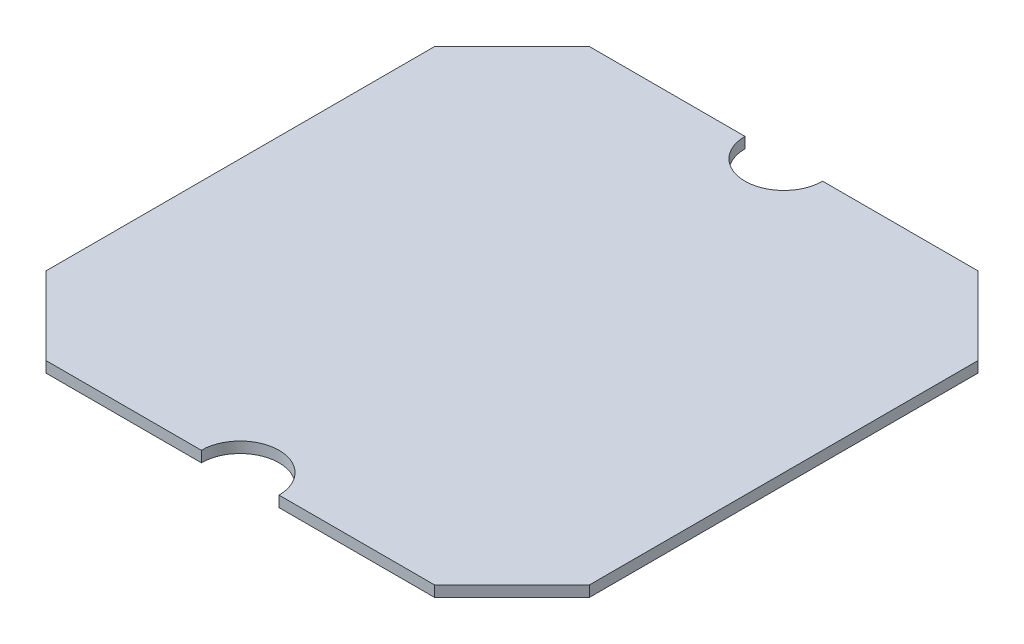
ISO-10303-21;
HEADER;
FILE_DESCRIPTION(('STEP AP214'),'2;1');
FILE_NAME('part.step','',(''),(''),'','','');
FILE_SCHEMA(('AUTOMOTIVE_DESIGN { 1 0 10303 214 1 1 1 1 }'));
ENDSEC;
DATA;
#1=APPLICATION_CONTEXT('core data for automotive mechanical design processes');
#2=APPLICATION_PROTOCOL_DEFINITION('international standard','automotive_design',2000,#1);
#3=PRODUCT_CONTEXT('',#1,'mechanical');
#4=PRODUCT('Part','Part','',(#3));
#5=PRODUCT_RELATED_PRODUCT_CATEGORY('part','',(#4));
#6=PRODUCT_DEFINITION_FORMATION('','',#4);
#7=PRODUCT_DEFINITION_CONTEXT('part definition',#1,'design');
#8=PRODUCT_DEFINITION('design','',#6,#7);
#9=PRODUCT_DEFINITION_SHAPE('','',#8);
#10=(LENGTH_UNIT() NAMED_UNIT(*) SI_UNIT(.MILLI.,.METRE.));
#11=(NAMED_UNIT(*) PLANE_ANGLE_UNIT() SI_UNIT($,.RADIAN.));
#12=(NAMED_UNIT(*) SI_UNIT($,.STERADIAN.) SOLID_ANGLE_UNIT());
#13=UNCERTAINTY_MEASURE_WITH_UNIT(LENGTH_MEASURE(1.E-05),#10,'distance_accuracy_value','');
#14=(GEOMETRIC_REPRESENTATION_CONTEXT(3) GLOBAL_UNCERTAINTY_ASSIGNED_CONTEXT((#13)) GLOBAL_UNIT_ASSIGNED_CONTEXT((#10,
#11,#12)) REPRESENTATION_CONTEXT('',''));
#15=CARTESIAN_POINT('',(0.,0.,0.));
#16=DIRECTION('',(0.,0.,1.));
#17=DIRECTION('',(1.,0.,0.));
#18=AXIS2_PLACEMENT_3D('',#15,#16,#17);
#19=CARTESIAN_POINT('',(2.9041511160257E-11,7.,-175.000000000002));
#20=DIRECTION('',(0.,-1.,0.));
#21=DIRECTION('',(0.,0.,-1.));
#22=AXIS2_PLACEMENT_3D('',#19,#20,#21);
#23=CYLINDRICAL_SURFACE('',#22,25.);
#24=CARTESIAN_POINT('',(2.9041511160257E-11,0.,-175.000000000002));
#25=DIRECTION('',(0.,-1.,0.));
#26=DIRECTION('',(0.,0.,1.));
#27=AXIS2_PLACEMENT_3D('',#24,#25,#26);
#28=CIRCLE('',#27,25.);
#29=CARTESIAN_POINT('',(25.000000000029,0.,-175.000000000006));
#30=VERTEX_POINT('',#29);
#31=CARTESIAN_POINT('',(-24.999999999971,0.,-175.000000000006));
#32=VERTEX_POINT('',#31);
#33=EDGE_CURVE('E166',#30,#32,#28,.T.);
#34=ORIENTED_EDGE('',*,*,#33,.T.);
#35=DIRECTION('',(0.,-1.,0.));
#36=VECTOR('',#35,1.);
#37=CARTESIAN_POINT('',(-24.999999999971,7.,-175.000000000006));
#38=LINE('',#37,#36);
#39=CARTESIAN_POINT('',(-24.999999999971,7.,-175.000000000006));
#40=VERTEX_POINT('',#39);
#41=EDGE_CURVE('E11',#40,#32,#38,.T.);
#42=ORIENTED_EDGE('',*,*,#41,.F.);
#43=CARTESIAN_POINT('',(2.9041511160257E-11,7.,-175.000000000002));
#44=DIRECTION('',(0.,-1.,0.));
#45=DIRECTION('',(0.,0.,1.));
#46=AXIS2_PLACEMENT_3D('',#43,#44,#45);
#47=CIRCLE('',#46,25.);
#48=CARTESIAN_POINT('',(25.000000000029,7.,-175.000000000006));
#49=VERTEX_POINT('',#48);
#50=EDGE_CURVE('E200',#49,#40,#47,.T.);
#51=ORIENTED_EDGE('',*,*,#50,.F.);
#52=DIRECTION('',(0.,-1.,0.));
#53=VECTOR('',#52,1.);
#54=CARTESIAN_POINT('',(25.000000000029,7.,-175.000000000006));
#55=LINE('',#54,#53);
#56=EDGE_CURVE('E162',#49,#30,#55,.T.);
#57=ORIENTED_EDGE('',*,*,#56,.T.);
#58=EDGE_LOOP('',(#34,#42,#51,#57));
#59=FACE_BOUND('',#58,.T.);
#60=ADVANCED_FACE('F41',(#59),#23,.F.);
#61=CARTESIAN_POINT('',(-124.999999999999,7.,-175.000000000006));
#62=DIRECTION('',(0.,0.,1.));
#63=DIRECTION('',(1.,0.,0.));
#64=AXIS2_PLACEMENT_3D('',#61,#62,#63);
#65=PLANE('',#64);
#66=DIRECTION('',(-1.,0.,0.));
#67=VECTOR('',#66,1.);
#68=CARTESIAN_POINT('',(-124.999999999999,0.,-175.000000000006));
#69=LINE('',#68,#67);
#70=CARTESIAN_POINT('',(-124.999999999999,0.,-175.000000000006));
#71=VERTEX_POINT('',#70);
#72=EDGE_CURVE('E170',#32,#71,#69,.T.);
#73=ORIENTED_EDGE('',*,*,#72,.T.);
#74=DIRECTION('',(0.,-1.,0.));
#75=VECTOR('',#74,1.);
#76=CARTESIAN_POINT('',(-124.999999999999,7.,-175.000000000006));
#77=LINE('',#76,#75);
#78=CARTESIAN_POINT('',(-124.999999999999,7.,-175.000000000006));
#79=VERTEX_POINT('',#78);
#80=EDGE_CURVE('E50',#79,#71,#77,.T.);
#81=ORIENTED_EDGE('',*,*,#80,.F.);
#82=DIRECTION('',(-1.,0.,0.));
#83=VECTOR('',#82,1.);
#84=CARTESIAN_POINT('',(-124.999999999999,7.,-175.000000000006));
#85=LINE('',#84,#83);
#86=EDGE_CURVE('E113',#40,#79,#85,.T.);
#87=ORIENTED_EDGE('',*,*,#86,.F.);
#88=ORIENTED_EDGE('',*,*,#41,.T.);
#89=EDGE_LOOP('',(#73,#81,#87,#88));
#90=FACE_BOUND('',#89,.T.);
#91=ADVANCED_FACE('F294',(#90),#65,.F.);
#92=CARTESIAN_POINT('',(-175.000000000005,7.,-125.));
#93=DIRECTION('',(0.707106781186548,0.,0.707106781186548));
#94=DIRECTION('',(0.707106781186548,0.,-0.707106781186548));
#95=AXIS2_PLACEMENT_3D('',#92,#93,#94);
#96=PLANE('',#95);
#97=DIRECTION('',(-0.707106781186547,0.,0.707106781186547));
#98=VECTOR('',#97,1.);
#99=CARTESIAN_POINT('',(-175.000000000005,0.,-125.));
#100=LINE('',#99,#98);
#101=CARTESIAN_POINT('',(-175.000000000005,0.,-125.));
#102=VERTEX_POINT('',#101);
#103=EDGE_CURVE('E173',#71,#102,#100,.T.);
#104=ORIENTED_EDGE('',*,*,#103,.T.);
#105=DIRECTION('',(0.,-1.,0.));
#106=VECTOR('',#105,1.);
#107=CARTESIAN_POINT('',(-175.000000000005,7.,-125.));
#108=LINE('',#107,#106);
#109=CARTESIAN_POINT('',(-175.000000000005,7.,-125.));
#110=VERTEX_POINT('',#109);
#111=EDGE_CURVE('E227',#110,#102,#108,.T.);
#112=ORIENTED_EDGE('',*,*,#111,.F.);
#113=DIRECTION('',(-0.707106781186547,0.,0.707106781186547));
#114=VECTOR('',#113,1.);
#115=CARTESIAN_POINT('',(-175.000000000005,7.,-125.));
#116=LINE('',#115,#114);
#117=EDGE_CURVE('E237',#79,#110,#116,.T.);
#118=ORIENTED_EDGE('',*,*,#117,.F.);
#119=ORIENTED_EDGE('',*,*,#80,.T.);
#120=EDGE_LOOP('',(#104,#112,#118,#119));
#121=FACE_BOUND('',#120,.T.);
#122=ADVANCED_FACE('F235',(#121),#96,.F.);
#123=CARTESIAN_POINT('',(-175.000000000005,7.,-125.));
#124=DIRECTION('',(1.,0.,0.));
#125=DIRECTION('',(0.,0.,-1.));
#126=AXIS2_PLACEMENT_3D('',#123,#124,#125);
#127=PLANE('',#126);
#128=DIRECTION('',(0.,0.,1.));
#129=VECTOR('',#128,1.);
#130=CARTESIAN_POINT('',(-175.000000000005,0.,-125.));
#131=LINE('',#130,#129);
#132=CARTESIAN_POINT('',(-175.000000000005,0.,125.000000000003));
#133=VERTEX_POINT('',#132);
#134=EDGE_CURVE('E176',#102,#133,#131,.T.);
#135=ORIENTED_EDGE('',*,*,#134,.T.);
#136=DIRECTION('',(0.,-1.,0.));
#137=VECTOR('',#136,1.);
#138=CARTESIAN_POINT('',(-175.000000000005,7.,125.000000000003));
#139=LINE('',#138,#137);
#140=CARTESIAN_POINT('',(-175.000000000005,7.,125.000000000003));
#141=VERTEX_POINT('',#140);
#142=EDGE_CURVE('E223',#141,#133,#139,.T.);
#143=ORIENTED_EDGE('',*,*,#142,.F.);
#144=DIRECTION('',(0.,0.,1.));
#145=VECTOR('',#144,1.);
#146=CARTESIAN_POINT('',(-175.000000000005,7.,-125.));
#147=LINE('',#146,#145);
#148=EDGE_CURVE('E256',#110,#141,#147,.T.);
#149=ORIENTED_EDGE('',*,*,#148,.F.);
#150=ORIENTED_EDGE('',*,*,#111,.T.);
#151=EDGE_LOOP('',(#135,#143,#149,#150));
#152=FACE_BOUND('',#151,.T.);
#153=ADVANCED_FACE('F246',(#152),#127,.F.);
#154=CARTESIAN_POINT('',(-124.999999999999,7.,175.000000000009));
#155=DIRECTION('',(0.707106781186548,0.,-0.707106781186547));
#156=DIRECTION('',(-0.707106781186547,0.,-0.707106781186548));
#157=AXIS2_PLACEMENT_3D('',#154,#155,#156);
#158=PLANE('',#157);
#159=DIRECTION('',(0.707106781186547,0.,0.707106781186548));
#160=VECTOR('',#159,1.);
#161=CARTESIAN_POINT('',(-124.999999999999,0.,175.000000000009));
#162=LINE('',#161,#160);
#163=CARTESIAN_POINT('',(-124.999999999999,0.,175.000000000009));
#164=VERTEX_POINT('',#163);
#165=EDGE_CURVE('E179',#133,#164,#162,.T.);
#166=ORIENTED_EDGE('',*,*,#165,.T.);
#167=DIRECTION('',(0.,-1.,0.));
#168=VECTOR('',#167,1.);
#169=CARTESIAN_POINT('',(-124.999999999999,7.,175.000000000009));
#170=LINE('',#169,#168);
#171=CARTESIAN_POINT('',(-124.999999999999,7.,175.000000000009));
#172=VERTEX_POINT('',#171);
#173=EDGE_CURVE('E219',#172,#164,#170,.T.);
#174=ORIENTED_EDGE('',*,*,#173,.F.);
#175=DIRECTION('',(0.707106781186547,0.,0.707106781186548));
#176=VECTOR('',#175,1.);
#177=CARTESIAN_POINT('',(-124.999999999999,7.,175.000000000009));
#178=LINE('',#177,#176);
#179=EDGE_CURVE('E252',#141,#172,#178,.T.);
#180=ORIENTED_EDGE('',*,*,#179,.F.);
#181=ORIENTED_EDGE('',*,*,#142,.T.);
#182=EDGE_LOOP('',(#166,#174,#180,#181));
#183=FACE_BOUND('',#182,.T.);
#184=ADVANCED_FACE('F250',(#183),#158,.F.);
#185=CARTESIAN_POINT('',(-124.999999999999,7.,175.000000000009));
#186=DIRECTION('',(0.,0.,-1.));
#187=DIRECTION('',(-1.,0.,0.));
#188=AXIS2_PLACEMENT_3D('',#185,#186,#187);
#189=PLANE('',#188);
#190=DIRECTION('',(1.,0.,0.));
#191=VECTOR('',#190,1.);
#192=CARTESIAN_POINT('',(-124.999999999999,0.,175.000000000009));
#193=LINE('',#192,#191);
#194=CARTESIAN_POINT('',(-24.9999999999709,0.,175.000000000009));
#195=VERTEX_POINT('',#194);
#196=EDGE_CURVE('E182',#164,#195,#193,.T.);
#197=ORIENTED_EDGE('',*,*,#196,.T.);
#198=DIRECTION('',(0.,-1.,0.));
#199=VECTOR('',#198,1.);
#200=CARTESIAN_POINT('',(-24.9999999999709,7.,175.000000000009));
#201=LINE('',#200,#199);
#202=CARTESIAN_POINT('',(-24.9999999999709,7.,175.000000000009));
#203=VERTEX_POINT('',#202);
#204=EDGE_CURVE('E215',#203,#195,#201,.T.);
#205=ORIENTED_EDGE('',*,*,#204,.F.);
#206=DIRECTION('',(1.,0.,0.));
#207=VECTOR('',#206,1.);
#208=CARTESIAN_POINT('',(-124.999999999999,7.,175.000000000009));
#209=LINE('',#208,#207);
#210=EDGE_CURVE('E255',#172,#203,#209,.T.);
#211=ORIENTED_EDGE('',*,*,#210,.F.);
#212=ORIENTED_EDGE('',*,*,#173,.T.);
#213=EDGE_LOOP('',(#197,#205,#211,#212));
#214=FACE_BOUND('',#213,.T.);
#215=ADVANCED_FACE('F307',(#214),#189,.F.);
#216=CARTESIAN_POINT('',(2.90843737982271E-11,7.,175.00000000001));
#217=DIRECTION('',(0.,-1.,0.));
#218=DIRECTION('',(0.,0.,-1.));
#219=AXIS2_PLACEMENT_3D('',#216,#217,#218);
#220=CYLINDRICAL_SURFACE('',#219,25.);
#221=CARTESIAN_POINT('',(2.90843737982271E-11,0.,175.00000000001));
#222=DIRECTION('',(0.,-1.,0.));
#223=DIRECTION('',(0.,0.,1.));
#224=AXIS2_PLACEMENT_3D('',#221,#222,#223);
#225=CIRCLE('',#224,25.);
#226=CARTESIAN_POINT('',(25.0000000000291,0.,175.000000000009));
#227=VERTEX_POINT('',#226);
#228=EDGE_CURVE('E185',#195,#227,#225,.T.);
#229=ORIENTED_EDGE('',*,*,#228,.T.);
#230=DIRECTION('',(0.,-1.,0.));
#231=VECTOR('',#230,1.);
#232=CARTESIAN_POINT('',(25.0000000000291,7.,175.000000000009));
#233=LINE('',#232,#231);
#234=CARTESIAN_POINT('',(25.0000000000291,7.,175.000000000009));
#235=VERTEX_POINT('',#234);
#236=EDGE_CURVE('E211',#235,#227,#233,.T.);
#237=ORIENTED_EDGE('',*,*,#236,.F.);
#238=CARTESIAN_POINT('',(2.90843737982271E-11,7.,175.00000000001));
#239=DIRECTION('',(0.,-1.,0.));
#240=DIRECTION('',(0.,0.,1.));
#241=AXIS2_PLACEMENT_3D('',#238,#239,#240);
#242=CIRCLE('',#241,25.);
#243=EDGE_CURVE('E260',#203,#235,#242,.T.);
#244=ORIENTED_EDGE('',*,*,#243,.F.);
#245=ORIENTED_EDGE('',*,*,#204,.T.);
#246=EDGE_LOOP('',(#229,#237,#244,#245));
#247=FACE_BOUND('',#246,.T.);
#248=ADVANCED_FACE('F310',(#247),#220,.F.);
#249=CARTESIAN_POINT('',(25.0000000000291,7.,175.000000000009));
#250=DIRECTION('',(0.,0.,-1.));
#251=DIRECTION('',(-1.,0.,0.));
#252=AXIS2_PLACEMENT_3D('',#249,#250,#251);
#253=PLANE('',#252);
#254=DIRECTION('',(1.,0.,0.));
#255=VECTOR('',#254,1.);
#256=CARTESIAN_POINT('',(25.0000000000291,0.,175.000000000009));
#257=LINE('',#256,#255);
#258=CARTESIAN_POINT('',(125.000000000004,0.,175.000000000009));
#259=VERTEX_POINT('',#258);
#260=EDGE_CURVE('E188',#227,#259,#257,.T.);
#261=ORIENTED_EDGE('',*,*,#260,.T.);
#262=DIRECTION('',(0.,-1.,0.));
#263=VECTOR('',#262,1.);
#264=CARTESIAN_POINT('',(125.000000000004,7.,175.000000000009));
#265=LINE('',#264,#263);
#266=CARTESIAN_POINT('',(125.000000000004,7.,175.000000000009));
#267=VERTEX_POINT('',#266);
#268=EDGE_CURVE('E207',#267,#259,#265,.T.);
#269=ORIENTED_EDGE('',*,*,#268,.F.);
#270=DIRECTION('',(1.,0.,0.));
#271=VECTOR('',#270,1.);
#272=CARTESIAN_POINT('',(25.0000000000291,7.,175.000000000009));
#273=LINE('',#272,#271);
#274=EDGE_CURVE('E267',#235,#267,#273,.T.);
#275=ORIENTED_EDGE('',*,*,#274,.F.);
#276=ORIENTED_EDGE('',*,*,#236,.T.);
#277=EDGE_LOOP('',(#261,#269,#275,#276));
#278=FACE_BOUND('',#277,.T.);
#279=ADVANCED_FACE('F275',(#278),#253,.F.);
#280=CARTESIAN_POINT('',(175.00000000001,7.,125.000000000003));
#281=DIRECTION('',(-0.707106781186547,0.,-0.707106781186547));
#282=DIRECTION('',(-0.707106781186548,0.,0.707106781186548));
#283=AXIS2_PLACEMENT_3D('',#280,#281,#282);
#284=PLANE('',#283);
#285=DIRECTION('',(0.707106781186548,0.,-0.707106781186548));
#286=VECTOR('',#285,1.);
#287=CARTESIAN_POINT('',(175.00000000001,0.,125.000000000003));
#288=LINE('',#287,#286);
#289=CARTESIAN_POINT('',(175.00000000001,0.,125.000000000003));
#290=VERTEX_POINT('',#289);
#291=EDGE_CURVE('E191',#259,#290,#288,.T.);
#292=ORIENTED_EDGE('',*,*,#291,.T.);
#293=DIRECTION('',(0.,-1.,0.));
#294=VECTOR('',#293,1.);
#295=CARTESIAN_POINT('',(175.00000000001,7.,125.000000000003));
#296=LINE('',#295,#294);
#297=CARTESIAN_POINT('',(175.00000000001,7.,125.000000000003));
#298=VERTEX_POINT('',#297);
#299=EDGE_CURVE('E155',#298,#290,#296,.T.);
#300=ORIENTED_EDGE('',*,*,#299,.F.);
#301=DIRECTION('',(0.707106781186548,0.,-0.707106781186548));
#302=VECTOR('',#301,1.);
#303=CARTESIAN_POINT('',(175.00000000001,7.,125.000000000003));
#304=LINE('',#303,#302);
#305=EDGE_CURVE('E144',#267,#298,#304,.T.);
#306=ORIENTED_EDGE('',*,*,#305,.F.);
#307=ORIENTED_EDGE('',*,*,#268,.T.);
#308=EDGE_LOOP('',(#292,#300,#306,#307));
#309=FACE_BOUND('',#308,.T.);
#310=ADVANCED_FACE('F279',(#309),#284,.F.);
#311=CARTESIAN_POINT('',(175.00000000001,7.,-125.));
#312=DIRECTION('',(-1.,0.,0.));
#313=DIRECTION('',(0.,0.,1.));
#314=AXIS2_PLACEMENT_3D('',#311,#312,#313);
#315=PLANE('',#314);
#316=DIRECTION('',(0.,0.,-1.));
#317=VECTOR('',#316,1.);
#318=CARTESIAN_POINT('',(175.00000000001,0.,-125.));
#319=LINE('',#318,#317);
#320=CARTESIAN_POINT('',(175.00000000001,0.,-125.));
#321=VERTEX_POINT('',#320);
#322=EDGE_CURVE('E153',#290,#321,#319,.T.);
#323=ORIENTED_EDGE('',*,*,#322,.T.);
#324=DIRECTION('',(0.,-1.,0.));
#325=VECTOR('',#324,1.);
#326=CARTESIAN_POINT('',(175.00000000001,7.,-125.));
#327=LINE('',#326,#325);
#328=CARTESIAN_POINT('',(175.00000000001,7.,-125.));
#329=VERTEX_POINT('',#328);
#330=EDGE_CURVE('E150',#329,#321,#327,.T.);
#331=ORIENTED_EDGE('',*,*,#330,.F.);
#332=DIRECTION('',(0.,0.,-1.));
#333=VECTOR('',#332,1.);
#334=CARTESIAN_POINT('',(175.00000000001,7.,-125.));
#335=LINE('',#334,#333);
#336=EDGE_CURVE('E138',#298,#329,#335,.T.);
#337=ORIENTED_EDGE('',*,*,#336,.F.);
#338=ORIENTED_EDGE('',*,*,#299,.T.);
#339=EDGE_LOOP('',(#323,#331,#337,#338));
#340=FACE_BOUND('',#339,.T.);
#341=ADVANCED_FACE('F151',(#340),#315,.F.);
#342=CARTESIAN_POINT('',(125.000000000004,7.,-175.000000000006));
#343=DIRECTION('',(-0.707106781186548,0.,0.707106781186548));
#344=DIRECTION('',(0.707106781186548,0.,0.707106781186547));
#345=AXIS2_PLACEMENT_3D('',#342,#343,#344);
#346=PLANE('',#345);
#347=DIRECTION('',(-0.707106781186548,0.,-0.707106781186547));
#348=VECTOR('',#347,1.);
#349=CARTESIAN_POINT('',(125.000000000004,0.,-175.000000000006));
#350=LINE('',#349,#348);
#351=CARTESIAN_POINT('',(125.000000000004,0.,-175.000000000006));
#352=VERTEX_POINT('',#351);
#353=EDGE_CURVE('E99',#321,#352,#350,.T.);
#354=ORIENTED_EDGE('',*,*,#353,.T.);
#355=DIRECTION('',(0.,-1.,0.));
#356=VECTOR('',#355,1.);
#357=CARTESIAN_POINT('',(125.000000000004,7.,-175.000000000006));
#358=LINE('',#357,#356);
#359=CARTESIAN_POINT('',(125.000000000004,7.,-175.000000000006));
#360=VERTEX_POINT('',#359);
#361=EDGE_CURVE('E156',#360,#352,#358,.T.);
#362=ORIENTED_EDGE('',*,*,#361,.F.);
#363=DIRECTION('',(-0.707106781186548,0.,-0.707106781186547));
#364=VECTOR('',#363,1.);
#365=CARTESIAN_POINT('',(125.000000000004,7.,-175.000000000006));
#366=LINE('',#365,#364);
#367=EDGE_CURVE('E142',#329,#360,#366,.T.);
#368=ORIENTED_EDGE('',*,*,#367,.F.);
#369=ORIENTED_EDGE('',*,*,#330,.T.);
#370=EDGE_LOOP('',(#354,#362,#368,#369));
#371=FACE_BOUND('',#370,.T.);
#372=ADVANCED_FACE('F158',(#371),#346,.F.);
#373=CARTESIAN_POINT('',(25.000000000029,7.,-175.000000000006));
#374=DIRECTION('',(0.,0.,1.));
#375=DIRECTION('',(1.,0.,0.));
#376=AXIS2_PLACEMENT_3D('',#373,#374,#375);
#377=PLANE('',#376);
#378=DIRECTION('',(-1.,0.,0.));
#379=VECTOR('',#378,1.);
#380=CARTESIAN_POINT('',(25.000000000029,0.,-175.000000000006));
#381=LINE('',#380,#379);
#382=EDGE_CURVE('E105',#352,#30,#381,.T.);
#383=ORIENTED_EDGE('',*,*,#382,.T.);
#384=ORIENTED_EDGE('',*,*,#56,.F.);
#385=DIRECTION('',(-1.,0.,0.));
#386=VECTOR('',#385,1.);
#387=CARTESIAN_POINT('',(25.000000000029,7.,-175.000000000006));
#388=LINE('',#387,#386);
#389=EDGE_CURVE('E58',#360,#49,#388,.T.);
#390=ORIENTED_EDGE('',*,*,#389,.F.);
#391=ORIENTED_EDGE('',*,*,#361,.T.);
#392=EDGE_LOOP('',(#383,#384,#390,#391));
#393=FACE_BOUND('',#392,.T.);
#394=ADVANCED_FACE('F283',(#393),#377,.F.);
#395=CARTESIAN_POINT('',(2.9041511160257E-11,7.,-175.000000000002));
#396=DIRECTION('',(0.,1.,0.));
#397=DIRECTION('',(0.,0.,1.));
#398=AXIS2_PLACEMENT_3D('',#395,#396,#397);
#399=PLANE('',#398);
#400=ORIENTED_EDGE('',*,*,#50,.T.);
#401=ORIENTED_EDGE('',*,*,#86,.T.);
#402=ORIENTED_EDGE('',*,*,#117,.T.);
#403=ORIENTED_EDGE('',*,*,#148,.T.);
#404=ORIENTED_EDGE('',*,*,#179,.T.);
#405=ORIENTED_EDGE('',*,*,#210,.T.);
#406=ORIENTED_EDGE('',*,*,#243,.T.);
#407=ORIENTED_EDGE('',*,*,#274,.T.);
#408=ORIENTED_EDGE('',*,*,#305,.T.);
#409=ORIENTED_EDGE('',*,*,#336,.T.);
#410=ORIENTED_EDGE('',*,*,#367,.T.);
#411=ORIENTED_EDGE('',*,*,#389,.T.);
#412=EDGE_LOOP('',(#400,#401,#402,#403,#404,#405,#406,#407,#408,#409,#410,#411));
#413=FACE_BOUND('',#412,.T.);
#414=ADVANCED_FACE('F140',(#413),#399,.T.);
#415=CARTESIAN_POINT('',(2.9041511160257E-11,0.,-175.000000000002));
#416=DIRECTION('',(0.,1.,0.));
#417=DIRECTION('',(0.,0.,1.));
#418=AXIS2_PLACEMENT_3D('',#415,#416,#417);
#419=PLANE('',#418);
#420=ORIENTED_EDGE('',*,*,#33,.F.);
#421=ORIENTED_EDGE('',*,*,#382,.F.);
#422=ORIENTED_EDGE('',*,*,#353,.F.);
#423=ORIENTED_EDGE('',*,*,#322,.F.);
#424=ORIENTED_EDGE('',*,*,#291,.F.);
#425=ORIENTED_EDGE('',*,*,#260,.F.);
#426=ORIENTED_EDGE('',*,*,#228,.F.);
#427=ORIENTED_EDGE('',*,*,#196,.F.);
#428=ORIENTED_EDGE('',*,*,#165,.F.);
#429=ORIENTED_EDGE('',*,*,#134,.F.);
#430=ORIENTED_EDGE('',*,*,#103,.F.);
#431=ORIENTED_EDGE('',*,*,#72,.F.);
#432=EDGE_LOOP('',(#420,#421,#422,#423,#424,#425,#426,#427,#428,#429,#430,#431));
#433=FACE_BOUND('',#432,.T.);
#434=ADVANCED_FACE('F241',(#433),#419,.F.);
#435=CLOSED_SHELL('',(#60,#91,#122,#153,#184,#215,#248,#279,#310,#341,#372,#394,#414,#434));
#436=MANIFOLD_SOLID_BREP('B2',#435);
#437=ADVANCED_BREP_SHAPE_REPRESENTATION('',(#18,#436),#14);
#438=SHAPE_DEFINITION_REPRESENTATION(#9,#437);
ENDSEC;
END-ISO-10303-21;
